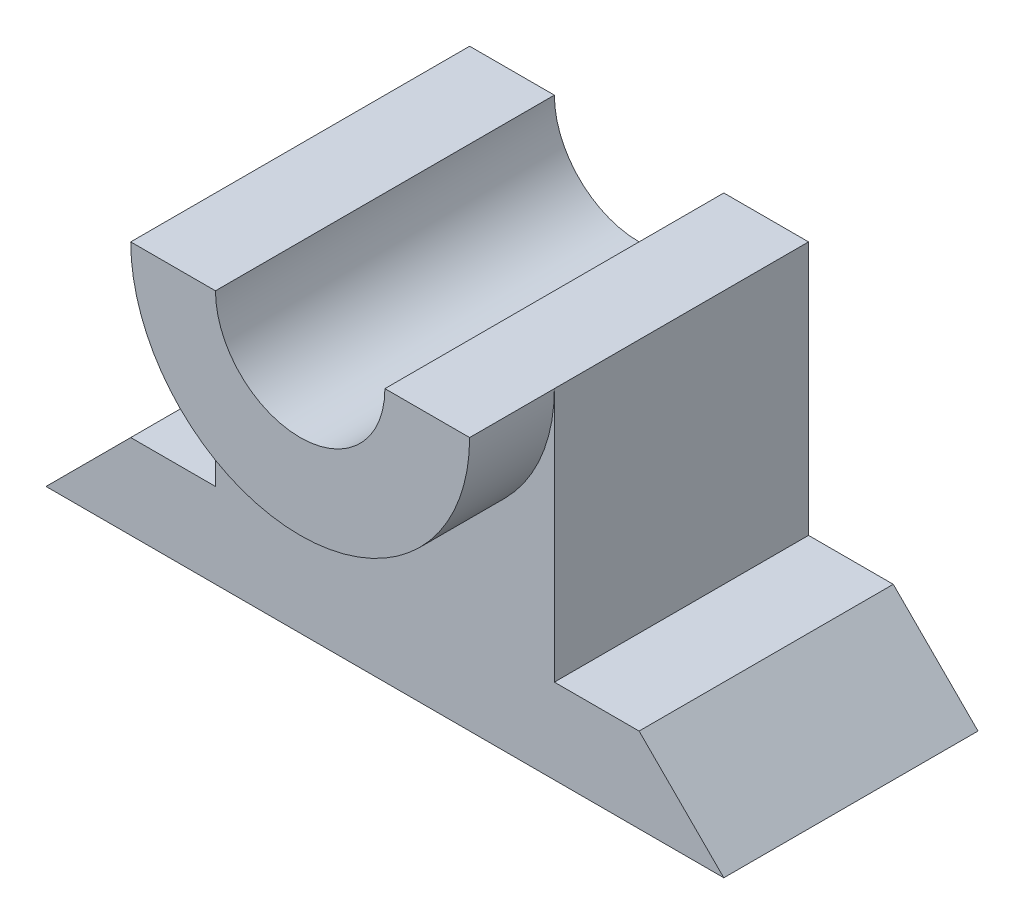
ISO-10303-21;
HEADER;
FILE_DESCRIPTION(('STEP AP214'),'2;1');
FILE_NAME('part.step','',(''),(''),'','','');
FILE_SCHEMA(('AUTOMOTIVE_DESIGN { 1 0 10303 214 1 1 1 1 }'));
ENDSEC;
DATA;
#1=APPLICATION_CONTEXT('core data for automotive mechanical design processes');
#2=APPLICATION_PROTOCOL_DEFINITION('international standard','automotive_design',2000,#1);
#3=PRODUCT_CONTEXT('',#1,'mechanical');
#4=PRODUCT('Part','Part','',(#3));
#5=PRODUCT_RELATED_PRODUCT_CATEGORY('part','',(#4));
#6=PRODUCT_DEFINITION_FORMATION('','',#4);
#7=PRODUCT_DEFINITION_CONTEXT('part definition',#1,'design');
#8=PRODUCT_DEFINITION('design','',#6,#7);
#9=PRODUCT_DEFINITION_SHAPE('','',#8);
#10=(LENGTH_UNIT() NAMED_UNIT(*) SI_UNIT(.MILLI.,.METRE.));
#11=(NAMED_UNIT(*) PLANE_ANGLE_UNIT() SI_UNIT($,.RADIAN.));
#12=(NAMED_UNIT(*) SI_UNIT($,.STERADIAN.) SOLID_ANGLE_UNIT());
#13=UNCERTAINTY_MEASURE_WITH_UNIT(LENGTH_MEASURE(1.E-05),#10,'distance_accuracy_value','');
#14=(GEOMETRIC_REPRESENTATION_CONTEXT(3) GLOBAL_UNCERTAINTY_ASSIGNED_CONTEXT((#13)) GLOBAL_UNIT_ASSIGNED_CONTEXT((#10,
#11,#12)) REPRESENTATION_CONTEXT('',''));
#15=CARTESIAN_POINT('',(0.,0.,0.));
#16=DIRECTION('',(0.,0.,1.));
#17=DIRECTION('',(1.,0.,0.));
#18=AXIS2_PLACEMENT_3D('',#15,#16,#17);
#19=CARTESIAN_POINT('',(0.,0.,-30.));
#20=DIRECTION('',(0.,-1.,0.));
#21=DIRECTION('',(1.,0.,0.));
#22=AXIS2_PLACEMENT_3D('',#19,#20,#21);
#23=PLANE('',#22);
#24=DIRECTION('',(0.,0.,1.));
#25=VECTOR('',#24,1.);
#26=CARTESIAN_POINT('',(-20.,0.,-30.));
#27=LINE('',#26,#25);
#28=CARTESIAN_POINT('',(-20.,0.,-30.));
#29=VERTEX_POINT('',#28);
#30=CARTESIAN_POINT('',(-20.,0.,0.));
#31=VERTEX_POINT('',#30);
#32=EDGE_CURVE('E38',#29,#31,#27,.T.);
#33=ORIENTED_EDGE('',*,*,#32,.T.);
#34=DIRECTION('',(0.,0.,-1.));
#35=VECTOR('',#34,1.);
#36=CARTESIAN_POINT('',(-20.,0.,10.));
#37=LINE('',#36,#35);
#38=CARTESIAN_POINT('',(-20.,0.,10.));
#39=VERTEX_POINT('',#38);
#40=EDGE_CURVE('E149',#39,#31,#37,.T.);
#41=ORIENTED_EDGE('',*,*,#40,.F.);
#42=DIRECTION('',(1.,0.,0.));
#43=VECTOR('',#42,1.);
#44=CARTESIAN_POINT('',(0.,0.,10.));
#45=LINE('',#44,#43);
#46=CARTESIAN_POINT('',(-10.,0.,10.));
#47=VERTEX_POINT('',#46);
#48=EDGE_CURVE('E232',#39,#47,#45,.T.);
#49=ORIENTED_EDGE('',*,*,#48,.T.);
#50=DIRECTION('',(0.,0.,1.));
#51=VECTOR('',#50,1.);
#52=CARTESIAN_POINT('',(-10.,0.,-30.));
#53=LINE('',#52,#51);
#54=CARTESIAN_POINT('',(-10.,0.,-30.));
#55=VERTEX_POINT('',#54);
#56=EDGE_CURVE('E11',#55,#47,#53,.T.);
#57=ORIENTED_EDGE('',*,*,#56,.F.);
#58=DIRECTION('',(1.,0.,0.));
#59=VECTOR('',#58,1.);
#60=CARTESIAN_POINT('',(0.,0.,-30.));
#61=LINE('',#60,#59);
#62=EDGE_CURVE('E162',#29,#55,#61,.T.);
#63=ORIENTED_EDGE('',*,*,#62,.F.);
#64=EDGE_LOOP('',(#33,#41,#49,#57,#63));
#65=FACE_BOUND('',#64,.T.);
#66=ADVANCED_FACE('F35',(#65),#23,.F.);
#67=CARTESIAN_POINT('',(0.,0.,-30.));
#68=DIRECTION('',(0.,0.,1.));
#69=DIRECTION('',(1.,0.,0.));
#70=AXIS2_PLACEMENT_3D('',#67,#68,#69);
#71=CYLINDRICAL_SURFACE('',#70,10.);
#72=ORIENTED_EDGE('',*,*,#56,.T.);
#73=CARTESIAN_POINT('',(0.,0.,10.));
#74=DIRECTION('',(0.,0.,1.));
#75=DIRECTION('',(1.,0.,0.));
#76=AXIS2_PLACEMENT_3D('',#73,#74,#75);
#77=CIRCLE('',#76,10.);
#78=CARTESIAN_POINT('',(10.,0.,10.));
#79=VERTEX_POINT('',#78);
#80=EDGE_CURVE('E192',#47,#79,#77,.T.);
#81=ORIENTED_EDGE('',*,*,#80,.T.);
#82=DIRECTION('',(0.,0.,1.));
#83=VECTOR('',#82,1.);
#84=CARTESIAN_POINT('',(10.,0.,-30.));
#85=LINE('',#84,#83);
#86=CARTESIAN_POINT('',(10.,0.,-30.));
#87=VERTEX_POINT('',#86);
#88=EDGE_CURVE('E44',#87,#79,#85,.T.);
#89=ORIENTED_EDGE('',*,*,#88,.F.);
#90=CARTESIAN_POINT('',(0.,0.,-30.));
#91=DIRECTION('',(0.,0.,1.));
#92=DIRECTION('',(1.,0.,0.));
#93=AXIS2_PLACEMENT_3D('',#90,#91,#92);
#94=CIRCLE('',#93,10.);
#95=EDGE_CURVE('E52',#55,#87,#94,.T.);
#96=ORIENTED_EDGE('',*,*,#95,.F.);
#97=EDGE_LOOP('',(#72,#81,#89,#96));
#98=FACE_BOUND('',#97,.T.);
#99=ADVANCED_FACE('F230',(#98),#71,.F.);
#100=CARTESIAN_POINT('',(0.,0.,-30.));
#101=DIRECTION('',(0.,-1.,0.));
#102=DIRECTION('',(1.,0.,0.));
#103=AXIS2_PLACEMENT_3D('',#100,#101,#102);
#104=PLANE('',#103);
#105=ORIENTED_EDGE('',*,*,#88,.T.);
#106=DIRECTION('',(1.,0.,0.));
#107=VECTOR('',#106,1.);
#108=CARTESIAN_POINT('',(0.,0.,10.));
#109=LINE('',#108,#107);
#110=CARTESIAN_POINT('',(20.,0.,10.));
#111=VERTEX_POINT('',#110);
#112=EDGE_CURVE('E237',#79,#111,#109,.T.);
#113=ORIENTED_EDGE('',*,*,#112,.T.);
#114=DIRECTION('',(0.,0.,-1.));
#115=VECTOR('',#114,1.);
#116=CARTESIAN_POINT('',(20.,0.,10.));
#117=LINE('',#116,#115);
#118=CARTESIAN_POINT('',(20.,0.,0.));
#119=VERTEX_POINT('',#118);
#120=EDGE_CURVE('E132',#111,#119,#117,.T.);
#121=ORIENTED_EDGE('',*,*,#120,.T.);
#122=DIRECTION('',(0.,0.,1.));
#123=VECTOR('',#122,1.);
#124=CARTESIAN_POINT('',(20.,0.,-30.));
#125=LINE('',#124,#123);
#126=CARTESIAN_POINT('',(20.,0.,-30.));
#127=VERTEX_POINT('',#126);
#128=EDGE_CURVE('E128',#127,#119,#125,.T.);
#129=ORIENTED_EDGE('',*,*,#128,.F.);
#130=DIRECTION('',(1.,0.,0.));
#131=VECTOR('',#130,1.);
#132=CARTESIAN_POINT('',(0.,0.,-30.));
#133=LINE('',#132,#131);
#134=EDGE_CURVE('E119',#87,#127,#133,.T.);
#135=ORIENTED_EDGE('',*,*,#134,.F.);
#136=EDGE_LOOP('',(#105,#113,#121,#129,#135));
#137=FACE_BOUND('',#136,.T.);
#138=ADVANCED_FACE('F129',(#137),#104,.F.);
#139=CARTESIAN_POINT('',(20.,0.,-30.));
#140=DIRECTION('',(-1.,0.,0.));
#141=DIRECTION('',(0.,-1.,0.));
#142=AXIS2_PLACEMENT_3D('',#139,#140,#141);
#143=PLANE('',#142);
#144=DIRECTION('',(0.,-1.,0.));
#145=VECTOR('',#144,1.);
#146=CARTESIAN_POINT('',(20.,0.,0.));
#147=LINE('',#146,#145);
#148=CARTESIAN_POINT('',(20.,-30.,0.));
#149=VERTEX_POINT('',#148);
#150=EDGE_CURVE('E87',#119,#149,#147,.T.);
#151=ORIENTED_EDGE('',*,*,#150,.T.);
#152=DIRECTION('',(0.,0.,1.));
#153=VECTOR('',#152,1.);
#154=CARTESIAN_POINT('',(20.,-30.,-30.));
#155=LINE('',#154,#153);
#156=CARTESIAN_POINT('',(20.,-30.,-30.));
#157=VERTEX_POINT('',#156);
#158=EDGE_CURVE('E134',#157,#149,#155,.T.);
#159=ORIENTED_EDGE('',*,*,#158,.F.);
#160=DIRECTION('',(0.,-1.,0.));
#161=VECTOR('',#160,1.);
#162=CARTESIAN_POINT('',(20.,0.,-30.));
#163=LINE('',#162,#161);
#164=EDGE_CURVE('E123',#127,#157,#163,.T.);
#165=ORIENTED_EDGE('',*,*,#164,.F.);
#166=ORIENTED_EDGE('',*,*,#128,.T.);
#167=EDGE_LOOP('',(#151,#159,#165,#166));
#168=FACE_BOUND('',#167,.T.);
#169=ADVANCED_FACE('F136',(#168),#143,.F.);
#170=CARTESIAN_POINT('',(0.,-30.,-30.));
#171=DIRECTION('',(0.,-1.,0.));
#172=DIRECTION('',(1.,0.,0.));
#173=AXIS2_PLACEMENT_3D('',#170,#171,#172);
#174=PLANE('',#173);
#175=DIRECTION('',(1.,0.,0.));
#176=VECTOR('',#175,1.);
#177=CARTESIAN_POINT('',(0.,-30.,0.));
#178=LINE('',#177,#176);
#179=CARTESIAN_POINT('',(30.,-30.,0.));
#180=VERTEX_POINT('',#179);
#181=EDGE_CURVE('E79',#149,#180,#178,.T.);
#182=ORIENTED_EDGE('',*,*,#181,.T.);
#183=DIRECTION('',(0.,0.,1.));
#184=VECTOR('',#183,1.);
#185=CARTESIAN_POINT('',(30.,-30.,-30.));
#186=LINE('',#185,#184);
#187=CARTESIAN_POINT('',(30.,-30.,-30.));
#188=VERTEX_POINT('',#187);
#189=EDGE_CURVE('E166',#188,#180,#186,.T.);
#190=ORIENTED_EDGE('',*,*,#189,.F.);
#191=DIRECTION('',(1.,0.,0.));
#192=VECTOR('',#191,1.);
#193=CARTESIAN_POINT('',(0.,-30.,-30.));
#194=LINE('',#193,#192);
#195=EDGE_CURVE('E138',#157,#188,#194,.T.);
#196=ORIENTED_EDGE('',*,*,#195,.F.);
#197=ORIENTED_EDGE('',*,*,#158,.T.);
#198=EDGE_LOOP('',(#182,#190,#196,#197));
#199=FACE_BOUND('',#198,.T.);
#200=ADVANCED_FACE('F261',(#199),#174,.F.);
#201=CARTESIAN_POINT('',(0.,0.,-30.));
#202=DIRECTION('',(-0.707106781186549,-0.707106781186547,0.));
#203=DIRECTION('',(0.707106781186547,-0.707106781186549,0.));
#204=AXIS2_PLACEMENT_3D('',#201,#202,#203);
#205=PLANE('',#204);
#206=DIRECTION('',(0.707106781186547,-0.707106781186549,0.));
#207=VECTOR('',#206,1.);
#208=CARTESIAN_POINT('',(0.,0.,0.));
#209=LINE('',#208,#207);
#210=CARTESIAN_POINT('',(40.,-40.,0.));
#211=VERTEX_POINT('',#210);
#212=EDGE_CURVE('E158',#180,#211,#209,.T.);
#213=ORIENTED_EDGE('',*,*,#212,.T.);
#214=DIRECTION('',(0.,0.,1.));
#215=VECTOR('',#214,1.);
#216=CARTESIAN_POINT('',(40.,-40.,-30.));
#217=LINE('',#216,#215);
#218=CARTESIAN_POINT('',(40.,-40.,-30.));
#219=VERTEX_POINT('',#218);
#220=EDGE_CURVE('E168',#219,#211,#217,.T.);
#221=ORIENTED_EDGE('',*,*,#220,.F.);
#222=DIRECTION('',(0.707106781186547,-0.707106781186549,0.));
#223=VECTOR('',#222,1.);
#224=CARTESIAN_POINT('',(0.,0.,-30.));
#225=LINE('',#224,#223);
#226=EDGE_CURVE('E140',#188,#219,#225,.T.);
#227=ORIENTED_EDGE('',*,*,#226,.F.);
#228=ORIENTED_EDGE('',*,*,#189,.T.);
#229=EDGE_LOOP('',(#213,#221,#227,#228));
#230=FACE_BOUND('',#229,.T.);
#231=ADVANCED_FACE('F212',(#230),#205,.F.);
#232=CARTESIAN_POINT('',(0.,-40.,-30.));
#233=DIRECTION('',(0.,-1.,0.));
#234=DIRECTION('',(1.,0.,0.));
#235=AXIS2_PLACEMENT_3D('',#232,#233,#234);
#236=PLANE('',#235);
#237=DIRECTION('',(1.,0.,0.));
#238=VECTOR('',#237,1.);
#239=CARTESIAN_POINT('',(0.,-40.,0.));
#240=LINE('',#239,#238);
#241=CARTESIAN_POINT('',(-40.,-40.,0.));
#242=VERTEX_POINT('',#241);
#243=EDGE_CURVE('E155',#242,#211,#240,.T.);
#244=ORIENTED_EDGE('',*,*,#243,.F.);
#245=DIRECTION('',(0.,0.,1.));
#246=VECTOR('',#245,1.);
#247=CARTESIAN_POINT('',(-40.,-40.,-30.));
#248=LINE('',#247,#246);
#249=CARTESIAN_POINT('',(-40.,-40.,-30.));
#250=VERTEX_POINT('',#249);
#251=EDGE_CURVE('E170',#250,#242,#248,.T.);
#252=ORIENTED_EDGE('',*,*,#251,.F.);
#253=DIRECTION('',(1.,0.,0.));
#254=VECTOR('',#253,1.);
#255=CARTESIAN_POINT('',(0.,-40.,-30.));
#256=LINE('',#255,#254);
#257=EDGE_CURVE('E205',#250,#219,#256,.T.);
#258=ORIENTED_EDGE('',*,*,#257,.T.);
#259=ORIENTED_EDGE('',*,*,#220,.T.);
#260=EDGE_LOOP('',(#244,#252,#258,#259));
#261=FACE_BOUND('',#260,.T.);
#262=ADVANCED_FACE('F216',(#261),#236,.T.);
#263=CARTESIAN_POINT('',(0.,0.,-30.));
#264=DIRECTION('',(-0.707106781186549,0.707106781186547,0.));
#265=DIRECTION('',(-0.707106781186547,-0.707106781186549,0.));
#266=AXIS2_PLACEMENT_3D('',#263,#264,#265);
#267=PLANE('',#266);
#268=DIRECTION('',(-0.707106781186547,-0.707106781186548,0.));
#269=VECTOR('',#268,1.);
#270=CARTESIAN_POINT('',(0.,0.,0.));
#271=LINE('',#270,#269);
#272=CARTESIAN_POINT('',(-30.,-30.,0.));
#273=VERTEX_POINT('',#272);
#274=EDGE_CURVE('E152',#273,#242,#271,.T.);
#275=ORIENTED_EDGE('',*,*,#274,.F.);
#276=DIRECTION('',(0.,0.,1.));
#277=VECTOR('',#276,1.);
#278=CARTESIAN_POINT('',(-30.,-30.,-30.));
#279=LINE('',#278,#277);
#280=CARTESIAN_POINT('',(-30.,-30.,-30.));
#281=VERTEX_POINT('',#280);
#282=EDGE_CURVE('E172',#281,#273,#279,.T.);
#283=ORIENTED_EDGE('',*,*,#282,.F.);
#284=DIRECTION('',(-0.707106781186547,-0.707106781186548,0.));
#285=VECTOR('',#284,1.);
#286=CARTESIAN_POINT('',(0.,0.,-30.));
#287=LINE('',#286,#285);
#288=EDGE_CURVE('E202',#281,#250,#287,.T.);
#289=ORIENTED_EDGE('',*,*,#288,.T.);
#290=ORIENTED_EDGE('',*,*,#251,.T.);
#291=EDGE_LOOP('',(#275,#283,#289,#290));
#292=FACE_BOUND('',#291,.T.);
#293=ADVANCED_FACE('F219',(#292),#267,.T.);
#294=CARTESIAN_POINT('',(0.,-30.,-30.));
#295=DIRECTION('',(0.,1.,0.));
#296=DIRECTION('',(0.,0.,1.));
#297=AXIS2_PLACEMENT_3D('',#294,#295,#296);
#298=PLANE('',#297);
#299=DIRECTION('',(-1.,0.,0.));
#300=VECTOR('',#299,1.);
#301=CARTESIAN_POINT('',(0.,-30.,0.));
#302=LINE('',#301,#300);
#303=CARTESIAN_POINT('',(-20.,-30.,0.));
#304=VERTEX_POINT('',#303);
#305=EDGE_CURVE('E148',#304,#273,#302,.T.);
#306=ORIENTED_EDGE('',*,*,#305,.F.);
#307=DIRECTION('',(0.,0.,1.));
#308=VECTOR('',#307,1.);
#309=CARTESIAN_POINT('',(-20.,-30.,-30.));
#310=LINE('',#309,#308);
#311=CARTESIAN_POINT('',(-20.,-30.,-30.));
#312=VERTEX_POINT('',#311);
#313=EDGE_CURVE('E173',#312,#304,#310,.T.);
#314=ORIENTED_EDGE('',*,*,#313,.F.);
#315=DIRECTION('',(-1.,0.,0.));
#316=VECTOR('',#315,1.);
#317=CARTESIAN_POINT('',(0.,-30.,-30.));
#318=LINE('',#317,#316);
#319=EDGE_CURVE('E199',#312,#281,#318,.T.);
#320=ORIENTED_EDGE('',*,*,#319,.T.);
#321=ORIENTED_EDGE('',*,*,#282,.T.);
#322=EDGE_LOOP('',(#306,#314,#320,#321));
#323=FACE_BOUND('',#322,.T.);
#324=ADVANCED_FACE('F222',(#323),#298,.T.);
#325=CARTESIAN_POINT('',(-20.,0.,-30.));
#326=DIRECTION('',(-1.,0.,0.));
#327=DIRECTION('',(0.,-1.,0.));
#328=AXIS2_PLACEMENT_3D('',#325,#326,#327);
#329=PLANE('',#328);
#330=DIRECTION('',(0.,-1.,0.));
#331=VECTOR('',#330,1.);
#332=CARTESIAN_POINT('',(-20.,0.,0.));
#333=LINE('',#332,#331);
#334=EDGE_CURVE('E145',#31,#304,#333,.T.);
#335=ORIENTED_EDGE('',*,*,#334,.F.);
#336=ORIENTED_EDGE('',*,*,#32,.F.);
#337=DIRECTION('',(0.,-1.,0.));
#338=VECTOR('',#337,1.);
#339=CARTESIAN_POINT('',(-20.,0.,-30.));
#340=LINE('',#339,#338);
#341=EDGE_CURVE('E197',#29,#312,#340,.T.);
#342=ORIENTED_EDGE('',*,*,#341,.T.);
#343=ORIENTED_EDGE('',*,*,#313,.T.);
#344=EDGE_LOOP('',(#335,#336,#342,#343));
#345=FACE_BOUND('',#344,.T.);
#346=ADVANCED_FACE('F183',(#345),#329,.T.);
#347=CARTESIAN_POINT('',(0.,0.,-30.));
#348=DIRECTION('',(0.,0.,1.));
#349=DIRECTION('',(1.,0.,0.));
#350=AXIS2_PLACEMENT_3D('',#347,#348,#349);
#351=PLANE('',#350);
#352=ORIENTED_EDGE('',*,*,#62,.T.);
#353=ORIENTED_EDGE('',*,*,#95,.T.);
#354=ORIENTED_EDGE('',*,*,#134,.T.);
#355=ORIENTED_EDGE('',*,*,#164,.T.);
#356=ORIENTED_EDGE('',*,*,#195,.T.);
#357=ORIENTED_EDGE('',*,*,#226,.T.);
#358=ORIENTED_EDGE('',*,*,#257,.F.);
#359=ORIENTED_EDGE('',*,*,#288,.F.);
#360=ORIENTED_EDGE('',*,*,#319,.F.);
#361=ORIENTED_EDGE('',*,*,#341,.F.);
#362=EDGE_LOOP('',(#352,#353,#354,#355,#356,#357,#358,#359,#360,#361));
#363=FACE_BOUND('',#362,.T.);
#364=ADVANCED_FACE('F121',(#363),#351,.F.);
#365=CARTESIAN_POINT('',(0.,0.,0.));
#366=DIRECTION('',(0.,0.,1.));
#367=DIRECTION('',(1.,0.,0.));
#368=AXIS2_PLACEMENT_3D('',#365,#366,#367);
#369=PLANE('',#368);
#370=CARTESIAN_POINT('',(0.,0.,0.));
#371=DIRECTION('',(0.,0.,1.));
#372=DIRECTION('',(1.,0.,0.));
#373=AXIS2_PLACEMENT_3D('',#370,#371,#372);
#374=CIRCLE('',#373,20.);
#375=EDGE_CURVE('E187',#31,#119,#374,.T.);
#376=ORIENTED_EDGE('',*,*,#375,.F.);
#377=ORIENTED_EDGE('',*,*,#334,.T.);
#378=ORIENTED_EDGE('',*,*,#305,.T.);
#379=ORIENTED_EDGE('',*,*,#274,.T.);
#380=ORIENTED_EDGE('',*,*,#243,.T.);
#381=ORIENTED_EDGE('',*,*,#212,.F.);
#382=ORIENTED_EDGE('',*,*,#181,.F.);
#383=ORIENTED_EDGE('',*,*,#150,.F.);
#384=EDGE_LOOP('',(#376,#377,#378,#379,#380,#381,#382,#383));
#385=FACE_BOUND('',#384,.T.);
#386=ADVANCED_FACE('F223',(#385),#369,.T.);
#387=CARTESIAN_POINT('',(0.,0.,10.));
#388=DIRECTION('',(0.,0.,-1.));
#389=DIRECTION('',(-1.,0.,0.));
#390=AXIS2_PLACEMENT_3D('',#387,#388,#389);
#391=CYLINDRICAL_SURFACE('',#390,20.);
#392=ORIENTED_EDGE('',*,*,#375,.T.);
#393=ORIENTED_EDGE('',*,*,#120,.F.);
#394=CARTESIAN_POINT('',(0.,0.,10.));
#395=DIRECTION('',(0.,0.,1.));
#396=DIRECTION('',(1.,0.,0.));
#397=AXIS2_PLACEMENT_3D('',#394,#395,#396);
#398=CIRCLE('',#397,20.);
#399=EDGE_CURVE('E189',#39,#111,#398,.T.);
#400=ORIENTED_EDGE('',*,*,#399,.F.);
#401=ORIENTED_EDGE('',*,*,#40,.T.);
#402=EDGE_LOOP('',(#392,#393,#400,#401));
#403=FACE_BOUND('',#402,.T.);
#404=ADVANCED_FACE('F186',(#403),#391,.T.);
#405=CARTESIAN_POINT('',(0.,0.,10.));
#406=DIRECTION('',(0.,0.,1.));
#407=DIRECTION('',(1.,0.,0.));
#408=AXIS2_PLACEMENT_3D('',#405,#406,#407);
#409=PLANE('',#408);
#410=ORIENTED_EDGE('',*,*,#48,.F.);
#411=ORIENTED_EDGE('',*,*,#399,.T.);
#412=ORIENTED_EDGE('',*,*,#112,.F.);
#413=ORIENTED_EDGE('',*,*,#80,.F.);
#414=EDGE_LOOP('',(#410,#411,#412,#413));
#415=FACE_BOUND('',#414,.T.);
#416=ADVANCED_FACE('F236',(#415),#409,.T.);
#417=CLOSED_SHELL('',(#66,#99,#138,#169,#200,#231,#262,#293,#324,#346,#364,#386,#404,#416));
#418=MANIFOLD_SOLID_BREP('B2',#417);
#419=ADVANCED_BREP_SHAPE_REPRESENTATION('',(#18,#418),#14);
#420=SHAPE_DEFINITION_REPRESENTATION(#9,#419);
ENDSEC;
END-ISO-10303-21;
